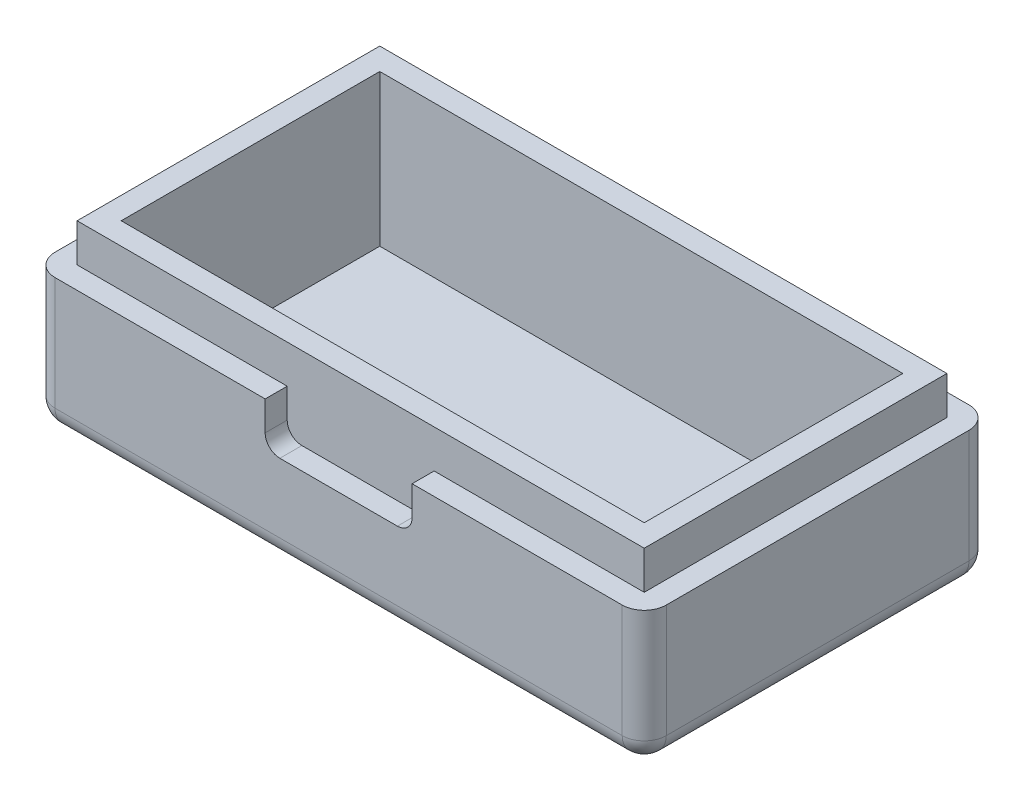
ISO-10303-21;
HEADER;
FILE_DESCRIPTION(('STEP AP214'),'2;1');
FILE_NAME('part.step','',(''),(''),'','','');
FILE_SCHEMA(('AUTOMOTIVE_DESIGN { 1 0 10303 214 1 1 1 1 }'));
ENDSEC;
DATA;
#1=APPLICATION_CONTEXT('core data for automotive mechanical design processes');
#2=APPLICATION_PROTOCOL_DEFINITION('international standard','automotive_design',2000,#1);
#3=PRODUCT_CONTEXT('',#1,'mechanical');
#4=PRODUCT('Part','Part','',(#3));
#5=PRODUCT_RELATED_PRODUCT_CATEGORY('part','',(#4));
#6=PRODUCT_DEFINITION_FORMATION('','',#4);
#7=PRODUCT_DEFINITION_CONTEXT('part definition',#1,'design');
#8=PRODUCT_DEFINITION('design','',#6,#7);
#9=PRODUCT_DEFINITION_SHAPE('','',#8);
#10=(LENGTH_UNIT() NAMED_UNIT(*) SI_UNIT(.MILLI.,.METRE.));
#11=(NAMED_UNIT(*) PLANE_ANGLE_UNIT() SI_UNIT($,.RADIAN.));
#12=(NAMED_UNIT(*) SI_UNIT($,.STERADIAN.) SOLID_ANGLE_UNIT());
#13=UNCERTAINTY_MEASURE_WITH_UNIT(LENGTH_MEASURE(1.E-05),#10,'distance_accuracy_value','');
#14=(GEOMETRIC_REPRESENTATION_CONTEXT(3) GLOBAL_UNCERTAINTY_ASSIGNED_CONTEXT((#13)) GLOBAL_UNIT_ASSIGNED_CONTEXT((#10,
#11,#12)) REPRESENTATION_CONTEXT('',''));
#15=CARTESIAN_POINT('',(0.,0.,0.));
#16=DIRECTION('',(0.,0.,1.));
#17=DIRECTION('',(1.,0.,0.));
#18=AXIS2_PLACEMENT_3D('',#15,#16,#17);
#19=CARTESIAN_POINT('',(0.,9.2,0.));
#20=DIRECTION('',(0.,1.,0.));
#21=DIRECTION('',(0.,0.,1.));
#22=AXIS2_PLACEMENT_3D('',#19,#20,#21);
#23=PLANE('',#22);
#24=DIRECTION('',(0.,0.,1.));
#25=VECTOR('',#24,1.);
#26=CARTESIAN_POINT('',(15.8,9.2,-11.9403065089106));
#27=LINE('',#26,#25);
#28=CARTESIAN_POINT('',(15.8,9.2,-1.5));
#29=VERTEX_POINT('',#28);
#30=CARTESIAN_POINT('',(15.8,9.2,0.));
#31=VERTEX_POINT('',#30);
#32=EDGE_CURVE('E263',#29,#31,#27,.T.);
#33=ORIENTED_EDGE('',*,*,#32,.F.);
#34=DIRECTION('',(1.,0.,0.));
#35=VECTOR('',#34,1.);
#36=CARTESIAN_POINT('',(1.5,9.2,-1.5));
#37=LINE('',#36,#35);
#38=CARTESIAN_POINT('',(1.5,9.2,-1.5));
#39=VERTEX_POINT('',#38);
#40=EDGE_CURVE('E316',#39,#29,#37,.T.);
#41=ORIENTED_EDGE('',*,*,#40,.F.);
#42=DIRECTION('',(0.,0.,1.));
#43=VECTOR('',#42,1.);
#44=CARTESIAN_POINT('',(1.5,9.2,-22.1));
#45=LINE('',#44,#43);
#46=CARTESIAN_POINT('',(1.5,9.2,-22.1));
#47=VERTEX_POINT('',#46);
#48=EDGE_CURVE('E311',#47,#39,#45,.T.);
#49=ORIENTED_EDGE('',*,*,#48,.F.);
#50=DIRECTION('',(-1.,0.,0.));
#51=VECTOR('',#50,1.);
#52=CARTESIAN_POINT('',(1.5,9.2,-22.1));
#53=LINE('',#52,#51);
#54=CARTESIAN_POINT('',(15.8,9.2,-22.1));
#55=VERTEX_POINT('',#54);
#56=EDGE_CURVE('E322',#55,#47,#53,.T.);
#57=ORIENTED_EDGE('',*,*,#56,.F.);
#58=DIRECTION('',(0.,0.,-1.));
#59=VECTOR('',#58,1.);
#60=CARTESIAN_POINT('',(15.8,9.2,-11.6596934910894));
#61=LINE('',#60,#59);
#62=CARTESIAN_POINT('',(15.8,9.2,-23.6));
#63=VERTEX_POINT('',#62);
#64=EDGE_CURVE('E299',#55,#63,#61,.T.);
#65=ORIENTED_EDGE('',*,*,#64,.T.);
#66=DIRECTION('',(-1.,0.,0.));
#67=VECTOR('',#66,1.);
#68=CARTESIAN_POINT('',(0.,9.2,-23.6));
#69=LINE('',#68,#67);
#70=CARTESIAN_POINT('',(1.49999999999999,9.2,-23.6));
#71=VERTEX_POINT('',#70);
#72=EDGE_CURVE('E356',#63,#71,#69,.T.);
#73=ORIENTED_EDGE('',*,*,#72,.T.);
#74=CARTESIAN_POINT('',(1.49999999999999,9.2,-22.1));
#75=DIRECTION('',(0.,1.,0.));
#76=DIRECTION('',(0.,0.,1.));
#77=AXIS2_PLACEMENT_3D('',#74,#75,#76);
#78=CIRCLE('',#77,1.5);
#79=CARTESIAN_POINT('',(0.,9.2,-22.1));
#80=VERTEX_POINT('',#79);
#81=EDGE_CURVE('E430',#71,#80,#78,.T.);
#82=ORIENTED_EDGE('',*,*,#81,.T.);
#83=DIRECTION('',(0.,0.,1.));
#84=VECTOR('',#83,1.);
#85=CARTESIAN_POINT('',(0.,9.2,-23.6));
#86=LINE('',#85,#84);
#87=CARTESIAN_POINT('',(0.,9.2,-1.5));
#88=VERTEX_POINT('',#87);
#89=EDGE_CURVE('E340',#80,#88,#86,.T.);
#90=ORIENTED_EDGE('',*,*,#89,.T.);
#91=CARTESIAN_POINT('',(1.5,9.2,-1.5));
#92=DIRECTION('',(0.,1.,0.));
#93=DIRECTION('',(0.,0.,1.));
#94=AXIS2_PLACEMENT_3D('',#91,#92,#93);
#95=CIRCLE('',#94,1.5);
#96=CARTESIAN_POINT('',(1.5,9.2,0.));
#97=VERTEX_POINT('',#96);
#98=EDGE_CURVE('E43',#88,#97,#95,.T.);
#99=ORIENTED_EDGE('',*,*,#98,.T.);
#100=DIRECTION('',(1.,0.,0.));
#101=VECTOR('',#100,1.);
#102=CARTESIAN_POINT('',(0.,9.2,0.));
#103=LINE('',#102,#101);
#104=EDGE_CURVE('E350',#97,#31,#103,.T.);
#105=ORIENTED_EDGE('',*,*,#104,.T.);
#106=EDGE_LOOP('',(#33,#41,#49,#57,#65,#73,#82,#90,#99,#105));
#107=FACE_BOUND('',#106,.T.);
#108=ADVANCED_FACE('F34',(#107),#23,.T.);
#109=CARTESIAN_POINT('',(0.,11.8,0.));
#110=DIRECTION('',(0.,-1.,0.));
#111=DIRECTION('',(0.,0.,-1.));
#112=AXIS2_PLACEMENT_3D('',#109,#110,#111);
#113=PLANE('',#112);
#114=DIRECTION('',(-1.,0.,0.));
#115=VECTOR('',#114,1.);
#116=CARTESIAN_POINT('',(2.99999999999999,11.8,-20.6));
#117=LINE('',#116,#115);
#118=CARTESIAN_POINT('',(38.6,11.8,-20.6));
#119=VERTEX_POINT('',#118);
#120=CARTESIAN_POINT('',(2.99999999999999,11.8,-20.6));
#121=VERTEX_POINT('',#120);
#122=EDGE_CURVE('E376',#119,#121,#117,.T.);
#123=ORIENTED_EDGE('',*,*,#122,.F.);
#124=DIRECTION('',(0.,0.,-1.));
#125=VECTOR('',#124,1.);
#126=CARTESIAN_POINT('',(38.6,11.8,-3.00000000000001));
#127=LINE('',#126,#125);
#128=CARTESIAN_POINT('',(38.6,11.8,-3.00000000000001));
#129=VERTEX_POINT('',#128);
#130=EDGE_CURVE('E360',#129,#119,#127,.T.);
#131=ORIENTED_EDGE('',*,*,#130,.F.);
#132=DIRECTION('',(1.,0.,0.));
#133=VECTOR('',#132,1.);
#134=CARTESIAN_POINT('',(2.99999999999999,11.8,-3.00000000000001));
#135=LINE('',#134,#133);
#136=CARTESIAN_POINT('',(2.99999999999999,11.8,-3.00000000000001));
#137=VERTEX_POINT('',#136);
#138=EDGE_CURVE('E365',#137,#129,#135,.T.);
#139=ORIENTED_EDGE('',*,*,#138,.F.);
#140=DIRECTION('',(0.,0.,1.));
#141=VECTOR('',#140,1.);
#142=CARTESIAN_POINT('',(2.99999999999999,11.8,-3.00000000000001));
#143=LINE('',#142,#141);
#144=EDGE_CURVE('E379',#121,#137,#143,.T.);
#145=ORIENTED_EDGE('',*,*,#144,.F.);
#146=EDGE_LOOP('',(#123,#131,#139,#145));
#147=FACE_BOUND('',#146,.T.);
#148=DIRECTION('',(0.,0.,1.));
#149=VECTOR('',#148,1.);
#150=CARTESIAN_POINT('',(1.5,11.8,-22.1));
#151=LINE('',#150,#149);
#152=CARTESIAN_POINT('',(1.5,11.8,-22.1));
#153=VERTEX_POINT('',#152);
#154=CARTESIAN_POINT('',(1.5,11.8,-1.5));
#155=VERTEX_POINT('',#154);
#156=EDGE_CURVE('E327',#153,#155,#151,.T.);
#157=ORIENTED_EDGE('',*,*,#156,.T.);
#158=DIRECTION('',(1.,0.,0.));
#159=VECTOR('',#158,1.);
#160=CARTESIAN_POINT('',(1.5,11.8,-1.5));
#161=LINE('',#160,#159);
#162=CARTESIAN_POINT('',(40.1,11.8,-1.5));
#163=VERTEX_POINT('',#162);
#164=EDGE_CURVE('E330',#155,#163,#161,.T.);
#165=ORIENTED_EDGE('',*,*,#164,.T.);
#166=DIRECTION('',(0.,0.,-1.));
#167=VECTOR('',#166,1.);
#168=CARTESIAN_POINT('',(40.1,11.8,-22.1));
#169=LINE('',#168,#167);
#170=CARTESIAN_POINT('',(40.1,11.8,-22.1));
#171=VERTEX_POINT('',#170);
#172=EDGE_CURVE('E333',#163,#171,#169,.T.);
#173=ORIENTED_EDGE('',*,*,#172,.T.);
#174=DIRECTION('',(-1.,0.,0.));
#175=VECTOR('',#174,1.);
#176=CARTESIAN_POINT('',(1.5,11.8,-22.1));
#177=LINE('',#176,#175);
#178=EDGE_CURVE('E315',#171,#153,#177,.T.);
#179=ORIENTED_EDGE('',*,*,#178,.T.);
#180=EDGE_LOOP('',(#157,#165,#173,#179));
#181=FACE_BOUND('',#180,.T.);
#182=ADVANCED_FACE('F521',(#147,#181),#113,.F.);
#183=CARTESIAN_POINT('',(38.6,1.5,-3.00000000000001));
#184=DIRECTION('',(1.,0.,0.));
#185=DIRECTION('',(0.,0.,-1.));
#186=AXIS2_PLACEMENT_3D('',#183,#184,#185);
#187=PLANE('',#186);
#188=ORIENTED_EDGE('',*,*,#130,.T.);
#189=DIRECTION('',(0.,1.,0.));
#190=VECTOR('',#189,1.);
#191=CARTESIAN_POINT('',(38.6,1.5,-20.6));
#192=LINE('',#191,#190);
#193=CARTESIAN_POINT('',(38.6,1.5,-20.6));
#194=VERTEX_POINT('',#193);
#195=EDGE_CURVE('E374',#194,#119,#192,.T.);
#196=ORIENTED_EDGE('',*,*,#195,.F.);
#197=DIRECTION('',(0.,0.,-1.));
#198=VECTOR('',#197,1.);
#199=CARTESIAN_POINT('',(38.6,1.5,-3.00000000000001));
#200=LINE('',#199,#198);
#201=CARTESIAN_POINT('',(38.6,1.5,-3.00000000000001));
#202=VERTEX_POINT('',#201);
#203=EDGE_CURVE('E361',#202,#194,#200,.T.);
#204=ORIENTED_EDGE('',*,*,#203,.F.);
#205=DIRECTION('',(0.,1.,0.));
#206=VECTOR('',#205,1.);
#207=CARTESIAN_POINT('',(38.6,1.5,-3.00000000000001));
#208=LINE('',#207,#206);
#209=EDGE_CURVE('E384',#202,#129,#208,.T.);
#210=ORIENTED_EDGE('',*,*,#209,.T.);
#211=EDGE_LOOP('',(#188,#196,#204,#210));
#212=FACE_BOUND('',#211,.T.);
#213=ADVANCED_FACE('F527',(#212),#187,.F.);
#214=CARTESIAN_POINT('',(2.99999999999999,1.5,-3.00000000000001));
#215=DIRECTION('',(0.,0.,1.));
#216=DIRECTION('',(1.,0.,0.));
#217=AXIS2_PLACEMENT_3D('',#214,#215,#216);
#218=PLANE('',#217);
#219=ORIENTED_EDGE('',*,*,#138,.T.);
#220=ORIENTED_EDGE('',*,*,#209,.F.);
#221=DIRECTION('',(1.,0.,0.));
#222=VECTOR('',#221,1.);
#223=CARTESIAN_POINT('',(2.99999999999999,1.5,-3.00000000000001));
#224=LINE('',#223,#222);
#225=CARTESIAN_POINT('',(2.99999999999999,1.5,-3.00000000000001));
#226=VERTEX_POINT('',#225);
#227=EDGE_CURVE('E371',#226,#202,#224,.T.);
#228=ORIENTED_EDGE('',*,*,#227,.F.);
#229=DIRECTION('',(0.,1.,0.));
#230=VECTOR('',#229,1.);
#231=CARTESIAN_POINT('',(2.99999999999999,1.5,-3.00000000000001));
#232=LINE('',#231,#230);
#233=EDGE_CURVE('E387',#226,#137,#232,.T.);
#234=ORIENTED_EDGE('',*,*,#233,.T.);
#235=EDGE_LOOP('',(#219,#220,#228,#234));
#236=FACE_BOUND('',#235,.T.);
#237=ADVANCED_FACE('F839',(#236),#218,.F.);
#238=CARTESIAN_POINT('',(2.99999999999999,1.5,-3.00000000000001));
#239=DIRECTION('',(-1.,0.,0.));
#240=DIRECTION('',(0.,0.,1.));
#241=AXIS2_PLACEMENT_3D('',#238,#239,#240);
#242=PLANE('',#241);
#243=ORIENTED_EDGE('',*,*,#144,.T.);
#244=ORIENTED_EDGE('',*,*,#233,.F.);
#245=DIRECTION('',(0.,0.,1.));
#246=VECTOR('',#245,1.);
#247=CARTESIAN_POINT('',(2.99999999999999,1.5,-3.00000000000001));
#248=LINE('',#247,#246);
#249=CARTESIAN_POINT('',(2.99999999999999,1.5,-20.6));
#250=VERTEX_POINT('',#249);
#251=EDGE_CURVE('E368',#250,#226,#248,.T.);
#252=ORIENTED_EDGE('',*,*,#251,.F.);
#253=DIRECTION('',(0.,1.,0.));
#254=VECTOR('',#253,1.);
#255=CARTESIAN_POINT('',(2.99999999999999,1.5,-20.6));
#256=LINE('',#255,#254);
#257=EDGE_CURVE('E389',#250,#121,#256,.T.);
#258=ORIENTED_EDGE('',*,*,#257,.T.);
#259=EDGE_LOOP('',(#243,#244,#252,#258));
#260=FACE_BOUND('',#259,.T.);
#261=ADVANCED_FACE('F843',(#260),#242,.F.);
#262=CARTESIAN_POINT('',(2.99999999999999,1.5,-20.6));
#263=DIRECTION('',(0.,0.,-1.));
#264=DIRECTION('',(-1.,0.,0.));
#265=AXIS2_PLACEMENT_3D('',#262,#263,#264);
#266=PLANE('',#265);
#267=ORIENTED_EDGE('',*,*,#122,.T.);
#268=ORIENTED_EDGE('',*,*,#257,.F.);
#269=DIRECTION('',(-1.,0.,0.));
#270=VECTOR('',#269,1.);
#271=CARTESIAN_POINT('',(2.99999999999999,1.5,-20.6));
#272=LINE('',#271,#270);
#273=EDGE_CURVE('E364',#194,#250,#272,.T.);
#274=ORIENTED_EDGE('',*,*,#273,.F.);
#275=ORIENTED_EDGE('',*,*,#195,.T.);
#276=EDGE_LOOP('',(#267,#268,#274,#275));
#277=FACE_BOUND('',#276,.T.);
#278=ADVANCED_FACE('F542',(#277),#266,.F.);
#279=CARTESIAN_POINT('',(0.,1.5,0.));
#280=DIRECTION('',(0.,-1.,0.));
#281=DIRECTION('',(0.,0.,-1.));
#282=AXIS2_PLACEMENT_3D('',#279,#280,#281);
#283=PLANE('',#282);
#284=ORIENTED_EDGE('',*,*,#203,.T.);
#285=ORIENTED_EDGE('',*,*,#273,.T.);
#286=ORIENTED_EDGE('',*,*,#251,.T.);
#287=ORIENTED_EDGE('',*,*,#227,.T.);
#288=EDGE_LOOP('',(#284,#285,#286,#287));
#289=FACE_BOUND('',#288,.T.);
#290=ADVANCED_FACE('F534',(#289),#283,.F.);
#291=DIRECTION('',(0.,0.,1.));
#292=VECTOR('',#291,1.);
#293=CARTESIAN_POINT('',(25.8,9.2,-11.9403065089106));
#294=LINE('',#293,#292);
#295=CARTESIAN_POINT('',(25.8,9.2,-1.5));
#296=VERTEX_POINT('',#295);
#297=CARTESIAN_POINT('',(25.8,9.2,0.));
#298=VERTEX_POINT('',#297);
#299=EDGE_CURVE('E265',#296,#298,#294,.T.);
#300=ORIENTED_EDGE('',*,*,#299,.T.);
#301=CARTESIAN_POINT('',(40.1,9.2,0.));
#302=VERTEX_POINT('',#301);
#303=EDGE_CURVE('E349',#298,#302,#103,.T.);
#304=ORIENTED_EDGE('',*,*,#303,.T.);
#305=CARTESIAN_POINT('',(40.1,9.2,-1.5));
#306=DIRECTION('',(0.,1.,0.));
#307=DIRECTION('',(0.,0.,1.));
#308=AXIS2_PLACEMENT_3D('',#305,#306,#307);
#309=CIRCLE('',#308,1.5);
#310=CARTESIAN_POINT('',(41.6,9.2,-1.5));
#311=VERTEX_POINT('',#310);
#312=EDGE_CURVE('E11',#302,#311,#309,.T.);
#313=ORIENTED_EDGE('',*,*,#312,.T.);
#314=DIRECTION('',(0.,0.,-1.));
#315=VECTOR('',#314,1.);
#316=CARTESIAN_POINT('',(41.6,9.2,-23.6));
#317=LINE('',#316,#315);
#318=CARTESIAN_POINT('',(41.6,9.2,-22.1));
#319=VERTEX_POINT('',#318);
#320=EDGE_CURVE('E353',#311,#319,#317,.T.);
#321=ORIENTED_EDGE('',*,*,#320,.T.);
#322=CARTESIAN_POINT('',(40.1,9.2,-22.1));
#323=DIRECTION('',(0.,1.,0.));
#324=DIRECTION('',(0.,0.,1.));
#325=AXIS2_PLACEMENT_3D('',#322,#323,#324);
#326=CIRCLE('',#325,1.5);
#327=CARTESIAN_POINT('',(40.1,9.2,-23.6));
#328=VERTEX_POINT('',#327);
#329=EDGE_CURVE('E428',#319,#328,#326,.T.);
#330=ORIENTED_EDGE('',*,*,#329,.T.);
#331=CARTESIAN_POINT('',(25.8,9.2,-23.6));
#332=VERTEX_POINT('',#331);
#333=EDGE_CURVE('E357',#328,#332,#69,.T.);
#334=ORIENTED_EDGE('',*,*,#333,.T.);
#335=DIRECTION('',(0.,0.,-1.));
#336=VECTOR('',#335,1.);
#337=CARTESIAN_POINT('',(25.8,9.2,-11.6596934910894));
#338=LINE('',#337,#336);
#339=CARTESIAN_POINT('',(25.8,9.2,-22.1));
#340=VERTEX_POINT('',#339);
#341=EDGE_CURVE('E278',#340,#332,#338,.T.);
#342=ORIENTED_EDGE('',*,*,#341,.F.);
#343=CARTESIAN_POINT('',(40.1,9.2,-22.1));
#344=VERTEX_POINT('',#343);
#345=EDGE_CURVE('E323',#344,#340,#53,.T.);
#346=ORIENTED_EDGE('',*,*,#345,.F.);
#347=DIRECTION('',(0.,0.,-1.));
#348=VECTOR('',#347,1.);
#349=CARTESIAN_POINT('',(40.1,9.2,-22.1));
#350=LINE('',#349,#348);
#351=CARTESIAN_POINT('',(40.1,9.2,-1.5));
#352=VERTEX_POINT('',#351);
#353=EDGE_CURVE('E319',#352,#344,#350,.T.);
#354=ORIENTED_EDGE('',*,*,#353,.F.);
#355=EDGE_CURVE('E314',#296,#352,#37,.T.);
#356=ORIENTED_EDGE('',*,*,#355,.F.);
#357=EDGE_LOOP('',(#300,#304,#313,#321,#330,#334,#342,#346,#354,#356));
#358=FACE_BOUND('',#357,.T.);
#359=ADVANCED_FACE('F523',(#358),#23,.T.);
#360=CARTESIAN_POINT('',(1.5,9.2,-22.1));
#361=DIRECTION('',(-1.,0.,0.));
#362=DIRECTION('',(0.,0.,1.));
#363=AXIS2_PLACEMENT_3D('',#360,#361,#362);
#364=PLANE('',#363);
#365=ORIENTED_EDGE('',*,*,#156,.F.);
#366=DIRECTION('',(0.,1.,0.));
#367=VECTOR('',#366,1.);
#368=CARTESIAN_POINT('',(1.5,9.2,-22.1));
#369=LINE('',#368,#367);
#370=EDGE_CURVE('E338',#47,#153,#369,.T.);
#371=ORIENTED_EDGE('',*,*,#370,.F.);
#372=ORIENTED_EDGE('',*,*,#48,.T.);
#373=DIRECTION('',(0.,1.,0.));
#374=VECTOR('',#373,1.);
#375=CARTESIAN_POINT('',(1.5,9.2,-1.5));
#376=LINE('',#375,#374);
#377=EDGE_CURVE('E326',#39,#155,#376,.T.);
#378=ORIENTED_EDGE('',*,*,#377,.T.);
#379=EDGE_LOOP('',(#365,#371,#372,#378));
#380=FACE_BOUND('',#379,.T.);
#381=ADVANCED_FACE('F533',(#380),#364,.T.);
#382=CARTESIAN_POINT('',(1.5,9.2,-22.1));
#383=DIRECTION('',(0.,0.,-1.));
#384=DIRECTION('',(-1.,0.,0.));
#385=AXIS2_PLACEMENT_3D('',#382,#383,#384);
#386=PLANE('',#385);
#387=ORIENTED_EDGE('',*,*,#178,.F.);
#388=DIRECTION('',(0.,1.,0.));
#389=VECTOR('',#388,1.);
#390=CARTESIAN_POINT('',(40.1,9.2,-22.1));
#391=LINE('',#390,#389);
#392=EDGE_CURVE('E341',#344,#171,#391,.T.);
#393=ORIENTED_EDGE('',*,*,#392,.F.);
#394=ORIENTED_EDGE('',*,*,#345,.T.);
#395=DIRECTION('',(0.,1.,0.));
#396=VECTOR('',#395,1.);
#397=CARTESIAN_POINT('',(25.8,9.2,-22.1));
#398=LINE('',#397,#396);
#399=CARTESIAN_POINT('',(25.8,7.20000000000001,-22.1));
#400=VERTEX_POINT('',#399);
#401=EDGE_CURVE('E282',#400,#340,#398,.T.);
#402=ORIENTED_EDGE('',*,*,#401,.F.);
#403=CARTESIAN_POINT('',(24.8,7.2,-22.1));
#404=DIRECTION('',(0.,0.,-1.));
#405=DIRECTION('',(-1.,0.,0.));
#406=AXIS2_PLACEMENT_3D('',#403,#404,#405);
#407=CIRCLE('',#406,1.);
#408=CARTESIAN_POINT('',(24.8,6.2,-22.1));
#409=VERTEX_POINT('',#408);
#410=EDGE_CURVE('E284',#409,#400,#407,.F.);
#411=ORIENTED_EDGE('',*,*,#410,.F.);
#412=DIRECTION('',(1.,0.,0.));
#413=VECTOR('',#412,1.);
#414=CARTESIAN_POINT('',(24.8,6.2,-22.1));
#415=LINE('',#414,#413);
#416=CARTESIAN_POINT('',(16.8,6.2,-22.1));
#417=VERTEX_POINT('',#416);
#418=EDGE_CURVE('E275',#417,#409,#415,.T.);
#419=ORIENTED_EDGE('',*,*,#418,.F.);
#420=CARTESIAN_POINT('',(16.8,7.2,-22.1));
#421=DIRECTION('',(0.,0.,-1.));
#422=DIRECTION('',(-1.,0.,0.));
#423=AXIS2_PLACEMENT_3D('',#420,#421,#422);
#424=CIRCLE('',#423,1.);
#425=CARTESIAN_POINT('',(15.8,7.2,-22.1));
#426=VERTEX_POINT('',#425);
#427=EDGE_CURVE('E277',#426,#417,#424,.F.);
#428=ORIENTED_EDGE('',*,*,#427,.F.);
#429=DIRECTION('',(0.,-1.,0.));
#430=VECTOR('',#429,1.);
#431=CARTESIAN_POINT('',(15.8,9.2,-22.1));
#432=LINE('',#431,#430);
#433=EDGE_CURVE('E280',#55,#426,#432,.T.);
#434=ORIENTED_EDGE('',*,*,#433,.F.);
#435=ORIENTED_EDGE('',*,*,#56,.T.);
#436=ORIENTED_EDGE('',*,*,#370,.T.);
#437=EDGE_LOOP('',(#387,#393,#394,#402,#411,#419,#428,#434,#435,#436));
#438=FACE_BOUND('',#437,.T.);
#439=ADVANCED_FACE('F540',(#438),#386,.T.);
#440=CARTESIAN_POINT('',(40.1,9.2,-22.1));
#441=DIRECTION('',(1.,0.,0.));
#442=DIRECTION('',(0.,0.,-1.));
#443=AXIS2_PLACEMENT_3D('',#440,#441,#442);
#444=PLANE('',#443);
#445=ORIENTED_EDGE('',*,*,#172,.F.);
#446=DIRECTION('',(0.,1.,0.));
#447=VECTOR('',#446,1.);
#448=CARTESIAN_POINT('',(40.1,9.2,-1.5));
#449=LINE('',#448,#447);
#450=EDGE_CURVE('E343',#352,#163,#449,.T.);
#451=ORIENTED_EDGE('',*,*,#450,.F.);
#452=ORIENTED_EDGE('',*,*,#353,.T.);
#453=ORIENTED_EDGE('',*,*,#392,.T.);
#454=EDGE_LOOP('',(#445,#451,#452,#453));
#455=FACE_BOUND('',#454,.T.);
#456=ADVANCED_FACE('F608',(#455),#444,.T.);
#457=CARTESIAN_POINT('',(1.5,9.2,-1.5));
#458=DIRECTION('',(0.,0.,1.));
#459=DIRECTION('',(1.,0.,0.));
#460=AXIS2_PLACEMENT_3D('',#457,#458,#459);
#461=PLANE('',#460);
#462=ORIENTED_EDGE('',*,*,#164,.F.);
#463=ORIENTED_EDGE('',*,*,#377,.F.);
#464=ORIENTED_EDGE('',*,*,#40,.T.);
#465=DIRECTION('',(0.,1.,0.));
#466=VECTOR('',#465,1.);
#467=CARTESIAN_POINT('',(15.8,9.2,-1.5));
#468=LINE('',#467,#466);
#469=CARTESIAN_POINT('',(15.8,7.20000000000001,-1.5));
#470=VERTEX_POINT('',#469);
#471=EDGE_CURVE('E274',#470,#29,#468,.T.);
#472=ORIENTED_EDGE('',*,*,#471,.F.);
#473=CARTESIAN_POINT('',(16.8,7.2,-1.5));
#474=DIRECTION('',(0.,0.,1.));
#475=DIRECTION('',(1.,0.,0.));
#476=AXIS2_PLACEMENT_3D('',#473,#474,#475);
#477=CIRCLE('',#476,1.);
#478=CARTESIAN_POINT('',(16.8,6.2,-1.5));
#479=VERTEX_POINT('',#478);
#480=EDGE_CURVE('E272',#479,#470,#477,.F.);
#481=ORIENTED_EDGE('',*,*,#480,.F.);
#482=DIRECTION('',(-1.,0.,0.));
#483=VECTOR('',#482,1.);
#484=CARTESIAN_POINT('',(16.8,6.2,-1.5));
#485=LINE('',#484,#483);
#486=CARTESIAN_POINT('',(24.8,6.2,-1.5));
#487=VERTEX_POINT('',#486);
#488=EDGE_CURVE('E242',#487,#479,#485,.T.);
#489=ORIENTED_EDGE('',*,*,#488,.F.);
#490=CARTESIAN_POINT('',(24.8,7.2,-1.5));
#491=DIRECTION('',(0.,0.,1.));
#492=DIRECTION('',(1.,0.,0.));
#493=AXIS2_PLACEMENT_3D('',#490,#491,#492);
#494=CIRCLE('',#493,1.);
#495=CARTESIAN_POINT('',(25.8,7.2,-1.5));
#496=VERTEX_POINT('',#495);
#497=EDGE_CURVE('E493',#496,#487,#494,.F.);
#498=ORIENTED_EDGE('',*,*,#497,.F.);
#499=DIRECTION('',(0.,-1.,0.));
#500=VECTOR('',#499,1.);
#501=CARTESIAN_POINT('',(25.8,9.2,-1.5));
#502=LINE('',#501,#500);
#503=EDGE_CURVE('E491',#296,#496,#502,.T.);
#504=ORIENTED_EDGE('',*,*,#503,.F.);
#505=ORIENTED_EDGE('',*,*,#355,.T.);
#506=ORIENTED_EDGE('',*,*,#450,.T.);
#507=EDGE_LOOP('',(#462,#463,#464,#472,#481,#489,#498,#504,#505,#506));
#508=FACE_BOUND('',#507,.T.);
#509=ADVANCED_FACE('F501',(#508),#461,.T.);
#510=CARTESIAN_POINT('',(0.,0.,0.));
#511=DIRECTION('',(0.,-1.,0.));
#512=DIRECTION('',(0.,0.,-1.));
#513=AXIS2_PLACEMENT_3D('',#510,#511,#512);
#514=PLANE('',#513);
#515=DIRECTION('',(0.,0.,-1.));
#516=VECTOR('',#515,1.);
#517=CARTESIAN_POINT('',(40.1,0.,0.));
#518=LINE('',#517,#516);
#519=CARTESIAN_POINT('',(40.1,0.,-22.1));
#520=VERTEX_POINT('',#519);
#521=CARTESIAN_POINT('',(40.1,0.,-1.5));
#522=VERTEX_POINT('',#521);
#523=EDGE_CURVE('E404',#520,#522,#518,.F.);
#524=ORIENTED_EDGE('',*,*,#523,.T.);
#525=DIRECTION('',(1.,0.,0.));
#526=VECTOR('',#525,1.);
#527=CARTESIAN_POINT('',(0.,0.,-1.5));
#528=LINE('',#527,#526);
#529=CARTESIAN_POINT('',(1.5,0.,-1.5));
#530=VERTEX_POINT('',#529);
#531=EDGE_CURVE('E406',#522,#530,#528,.F.);
#532=ORIENTED_EDGE('',*,*,#531,.T.);
#533=DIRECTION('',(0.,0.,1.));
#534=VECTOR('',#533,1.);
#535=CARTESIAN_POINT('',(1.49999999999999,0.,-23.6));
#536=LINE('',#535,#534);
#537=CARTESIAN_POINT('',(1.49999999999999,0.,-22.1));
#538=VERTEX_POINT('',#537);
#539=EDGE_CURVE('E400',#530,#538,#536,.F.);
#540=ORIENTED_EDGE('',*,*,#539,.T.);
#541=DIRECTION('',(-1.,0.,0.));
#542=VECTOR('',#541,1.);
#543=CARTESIAN_POINT('',(41.6,0.,-22.1));
#544=LINE('',#543,#542);
#545=EDGE_CURVE('E402',#538,#520,#544,.F.);
#546=ORIENTED_EDGE('',*,*,#545,.T.);
#547=EDGE_LOOP('',(#524,#532,#540,#546));
#548=FACE_BOUND('',#547,.T.);
#549=ADVANCED_FACE('F575',(#548),#514,.T.);
#550=CARTESIAN_POINT('',(0.,11.8,-23.6));
#551=DIRECTION('',(0.,0.,1.));
#552=DIRECTION('',(1.,0.,0.));
#553=AXIS2_PLACEMENT_3D('',#550,#551,#552);
#554=PLANE('',#553);
#555=CARTESIAN_POINT('',(24.8,7.2,-23.6));
#556=DIRECTION('',(0.,0.,-1.));
#557=DIRECTION('',(-1.,0.,0.));
#558=AXIS2_PLACEMENT_3D('',#555,#556,#557);
#559=CIRCLE('',#558,1.);
#560=CARTESIAN_POINT('',(25.8,7.2,-23.6));
#561=VERTEX_POINT('',#560);
#562=CARTESIAN_POINT('',(24.8,6.2,-23.6));
#563=VERTEX_POINT('',#562);
#564=EDGE_CURVE('E286',#561,#563,#559,.T.);
#565=ORIENTED_EDGE('',*,*,#564,.F.);
#566=DIRECTION('',(0.,-1.,0.));
#567=VECTOR('',#566,1.);
#568=CARTESIAN_POINT('',(25.8,9.2,-23.6));
#569=LINE('',#568,#567);
#570=EDGE_CURVE('E59',#332,#561,#569,.T.);
#571=ORIENTED_EDGE('',*,*,#570,.F.);
#572=ORIENTED_EDGE('',*,*,#333,.F.);
#573=DIRECTION('',(0.,-1.,0.));
#574=VECTOR('',#573,1.);
#575=CARTESIAN_POINT('',(40.1,11.8,-23.6));
#576=LINE('',#575,#574);
#577=CARTESIAN_POINT('',(40.1,1.5,-23.6));
#578=VERTEX_POINT('',#577);
#579=EDGE_CURVE('E415',#328,#578,#576,.T.);
#580=ORIENTED_EDGE('',*,*,#579,.T.);
#581=DIRECTION('',(-1.,0.,0.));
#582=VECTOR('',#581,1.);
#583=CARTESIAN_POINT('',(0.,1.5,-23.6));
#584=LINE('',#583,#582);
#585=CARTESIAN_POINT('',(1.49999999999999,1.5,-23.6));
#586=VERTEX_POINT('',#585);
#587=EDGE_CURVE('E417',#578,#586,#584,.T.);
#588=ORIENTED_EDGE('',*,*,#587,.T.);
#589=DIRECTION('',(0.,-1.,0.));
#590=VECTOR('',#589,1.);
#591=CARTESIAN_POINT('',(1.49999999999999,11.8,-23.6));
#592=LINE('',#591,#590);
#593=EDGE_CURVE('E419',#586,#71,#592,.F.);
#594=ORIENTED_EDGE('',*,*,#593,.T.);
#595=ORIENTED_EDGE('',*,*,#72,.F.);
#596=DIRECTION('',(0.,1.,0.));
#597=VECTOR('',#596,1.);
#598=CARTESIAN_POINT('',(15.8,9.2,-23.6));
#599=LINE('',#598,#597);
#600=CARTESIAN_POINT('',(15.8,7.20000000000001,-23.6));
#601=VERTEX_POINT('',#600);
#602=EDGE_CURVE('E295',#601,#63,#599,.T.);
#603=ORIENTED_EDGE('',*,*,#602,.F.);
#604=CARTESIAN_POINT('',(16.8,7.2,-23.6));
#605=DIRECTION('',(0.,0.,-1.));
#606=DIRECTION('',(-1.,0.,0.));
#607=AXIS2_PLACEMENT_3D('',#604,#605,#606);
#608=CIRCLE('',#607,1.);
#609=CARTESIAN_POINT('',(16.8,6.2,-23.6));
#610=VERTEX_POINT('',#609);
#611=EDGE_CURVE('E292',#610,#601,#608,.T.);
#612=ORIENTED_EDGE('',*,*,#611,.F.);
#613=DIRECTION('',(-1.,0.,0.));
#614=VECTOR('',#613,1.);
#615=CARTESIAN_POINT('',(24.8,6.2,-23.6));
#616=LINE('',#615,#614);
#617=EDGE_CURVE('E289',#563,#610,#616,.T.);
#618=ORIENTED_EDGE('',*,*,#617,.F.);
#619=EDGE_LOOP('',(#565,#571,#572,#580,#588,#594,#595,#603,#612,#618));
#620=FACE_BOUND('',#619,.T.);
#621=ADVANCED_FACE('F580',(#620),#554,.F.);
#622=CARTESIAN_POINT('',(41.6,11.8,0.));
#623=DIRECTION('',(-1.,0.,0.));
#624=DIRECTION('',(0.,0.,1.));
#625=AXIS2_PLACEMENT_3D('',#622,#623,#624);
#626=PLANE('',#625);
#627=ORIENTED_EDGE('',*,*,#320,.F.);
#628=DIRECTION('',(0.,-1.,0.));
#629=VECTOR('',#628,1.);
#630=CARTESIAN_POINT('',(41.6,11.8,-1.5));
#631=LINE('',#630,#629);
#632=CARTESIAN_POINT('',(41.6,1.5,-1.5));
#633=VERTEX_POINT('',#632);
#634=EDGE_CURVE('E413',#311,#633,#631,.T.);
#635=ORIENTED_EDGE('',*,*,#634,.T.);
#636=DIRECTION('',(0.,0.,-1.));
#637=VECTOR('',#636,1.);
#638=CARTESIAN_POINT('',(41.6,1.5,-23.6));
#639=LINE('',#638,#637);
#640=CARTESIAN_POINT('',(41.6,1.5,-22.1));
#641=VERTEX_POINT('',#640);
#642=EDGE_CURVE('E411',#633,#641,#639,.T.);
#643=ORIENTED_EDGE('',*,*,#642,.T.);
#644=DIRECTION('',(0.,-1.,0.));
#645=VECTOR('',#644,1.);
#646=CARTESIAN_POINT('',(41.6,11.8,-22.1));
#647=LINE('',#646,#645);
#648=EDGE_CURVE('E409',#641,#319,#647,.F.);
#649=ORIENTED_EDGE('',*,*,#648,.T.);
#650=EDGE_LOOP('',(#627,#635,#643,#649));
#651=FACE_BOUND('',#650,.T.);
#652=ADVANCED_FACE('F558',(#651),#626,.F.);
#653=CARTESIAN_POINT('',(0.,11.8,0.));
#654=DIRECTION('',(0.,0.,-1.));
#655=DIRECTION('',(-1.,0.,0.));
#656=AXIS2_PLACEMENT_3D('',#653,#654,#655);
#657=PLANE('',#656);
#658=CARTESIAN_POINT('',(16.8,7.2,0.));
#659=DIRECTION('',(0.,0.,1.));
#660=DIRECTION('',(1.,0.,0.));
#661=AXIS2_PLACEMENT_3D('',#658,#659,#660);
#662=CIRCLE('',#661,1.);
#663=CARTESIAN_POINT('',(15.8,7.2,0.));
#664=VERTEX_POINT('',#663);
#665=CARTESIAN_POINT('',(16.8,6.2,0.));
#666=VERTEX_POINT('',#665);
#667=EDGE_CURVE('E249',#664,#666,#662,.T.);
#668=ORIENTED_EDGE('',*,*,#667,.F.);
#669=DIRECTION('',(0.,-1.,0.));
#670=VECTOR('',#669,1.);
#671=CARTESIAN_POINT('',(15.8,9.2,0.));
#672=LINE('',#671,#670);
#673=EDGE_CURVE('E51',#31,#664,#672,.T.);
#674=ORIENTED_EDGE('',*,*,#673,.F.);
#675=ORIENTED_EDGE('',*,*,#104,.F.);
#676=DIRECTION('',(0.,-1.,0.));
#677=VECTOR('',#676,1.);
#678=CARTESIAN_POINT('',(1.5,11.8,0.));
#679=LINE('',#678,#677);
#680=CARTESIAN_POINT('',(1.5,1.5,0.));
#681=VERTEX_POINT('',#680);
#682=EDGE_CURVE('E386',#97,#681,#679,.T.);
#683=ORIENTED_EDGE('',*,*,#682,.T.);
#684=DIRECTION('',(1.,0.,0.));
#685=VECTOR('',#684,1.);
#686=CARTESIAN_POINT('',(41.6,1.5,0.));
#687=LINE('',#686,#685);
#688=CARTESIAN_POINT('',(40.1,1.5,0.));
#689=VERTEX_POINT('',#688);
#690=EDGE_CURVE('E394',#681,#689,#687,.T.);
#691=ORIENTED_EDGE('',*,*,#690,.T.);
#692=DIRECTION('',(0.,-1.,0.));
#693=VECTOR('',#692,1.);
#694=CARTESIAN_POINT('',(40.1,11.8,0.));
#695=LINE('',#694,#693);
#696=EDGE_CURVE('E397',#689,#302,#695,.F.);
#697=ORIENTED_EDGE('',*,*,#696,.T.);
#698=ORIENTED_EDGE('',*,*,#303,.F.);
#699=DIRECTION('',(0.,1.,0.));
#700=VECTOR('',#699,1.);
#701=CARTESIAN_POINT('',(25.8,9.2,0.));
#702=LINE('',#701,#700);
#703=CARTESIAN_POINT('',(25.8,7.20000000000001,0.));
#704=VERTEX_POINT('',#703);
#705=EDGE_CURVE('E258',#704,#298,#702,.T.);
#706=ORIENTED_EDGE('',*,*,#705,.F.);
#707=CARTESIAN_POINT('',(24.8,7.2,0.));
#708=DIRECTION('',(0.,0.,1.));
#709=DIRECTION('',(1.,0.,0.));
#710=AXIS2_PLACEMENT_3D('',#707,#708,#709);
#711=CIRCLE('',#710,1.);
#712=CARTESIAN_POINT('',(24.8,6.2,0.));
#713=VERTEX_POINT('',#712);
#714=EDGE_CURVE('E256',#713,#704,#711,.T.);
#715=ORIENTED_EDGE('',*,*,#714,.F.);
#716=DIRECTION('',(1.,0.,0.));
#717=VECTOR('',#716,1.);
#718=CARTESIAN_POINT('',(16.8,6.2,0.));
#719=LINE('',#718,#717);
#720=EDGE_CURVE('E239',#666,#713,#719,.T.);
#721=ORIENTED_EDGE('',*,*,#720,.F.);
#722=EDGE_LOOP('',(#668,#674,#675,#683,#691,#697,#698,#706,#715,#721));
#723=FACE_BOUND('',#722,.T.);
#724=ADVANCED_FACE('F253',(#723),#657,.F.);
#725=CARTESIAN_POINT('',(0.,11.8,0.));
#726=DIRECTION('',(1.,0.,0.));
#727=DIRECTION('',(0.,0.,-1.));
#728=AXIS2_PLACEMENT_3D('',#725,#726,#727);
#729=PLANE('',#728);
#730=DIRECTION('',(0.,0.,1.));
#731=VECTOR('',#730,1.);
#732=CARTESIAN_POINT('',(0.,1.5,0.));
#733=LINE('',#732,#731);
#734=CARTESIAN_POINT('',(0.,1.5,-22.1));
#735=VERTEX_POINT('',#734);
#736=CARTESIAN_POINT('',(0.,1.5,-1.5));
#737=VERTEX_POINT('',#736);
#738=EDGE_CURVE('E424',#735,#737,#733,.T.);
#739=ORIENTED_EDGE('',*,*,#738,.T.);
#740=DIRECTION('',(0.,-1.,0.));
#741=VECTOR('',#740,1.);
#742=CARTESIAN_POINT('',(0.,11.8,-1.5));
#743=LINE('',#742,#741);
#744=EDGE_CURVE('E426',#737,#88,#743,.F.);
#745=ORIENTED_EDGE('',*,*,#744,.T.);
#746=ORIENTED_EDGE('',*,*,#89,.F.);
#747=DIRECTION('',(0.,-1.,0.));
#748=VECTOR('',#747,1.);
#749=CARTESIAN_POINT('',(0.,11.8,-22.1));
#750=LINE('',#749,#748);
#751=EDGE_CURVE('E422',#80,#735,#750,.T.);
#752=ORIENTED_EDGE('',*,*,#751,.T.);
#753=EDGE_LOOP('',(#739,#745,#746,#752));
#754=FACE_BOUND('',#753,.T.);
#755=ADVANCED_FACE('F477',(#754),#729,.F.);
#756=CARTESIAN_POINT('',(1.49999999999999,11.8,-22.1));
#757=DIRECTION('',(0.,-1.,0.));
#758=DIRECTION('',(0.,0.,-1.));
#759=AXIS2_PLACEMENT_3D('',#756,#757,#758);
#760=CYLINDRICAL_SURFACE('',#759,1.5);
#761=ORIENTED_EDGE('',*,*,#81,.F.);
#762=ORIENTED_EDGE('',*,*,#593,.F.);
#763=CARTESIAN_POINT('',(1.49999999999999,1.5,-22.1));
#764=DIRECTION('',(0.,-1.,0.));
#765=DIRECTION('',(0.,0.,-1.));
#766=AXIS2_PLACEMENT_3D('',#763,#764,#765);
#767=CIRCLE('',#766,1.5);
#768=EDGE_CURVE('E459',#735,#586,#767,.T.);
#769=ORIENTED_EDGE('',*,*,#768,.F.);
#770=ORIENTED_EDGE('',*,*,#751,.F.);
#771=EDGE_LOOP('',(#761,#762,#769,#770));
#772=FACE_BOUND('',#771,.T.);
#773=ADVANCED_FACE('F36',(#772),#760,.T.);
#774=CARTESIAN_POINT('',(40.1,11.8,-22.1));
#775=DIRECTION('',(0.,-1.,0.));
#776=DIRECTION('',(0.,0.,-1.));
#777=AXIS2_PLACEMENT_3D('',#774,#775,#776);
#778=CYLINDRICAL_SURFACE('',#777,1.5);
#779=ORIENTED_EDGE('',*,*,#329,.F.);
#780=ORIENTED_EDGE('',*,*,#648,.F.);
#781=CARTESIAN_POINT('',(40.1,1.5,-22.1));
#782=DIRECTION('',(0.,-1.,0.));
#783=DIRECTION('',(0.,0.,-1.));
#784=AXIS2_PLACEMENT_3D('',#781,#782,#783);
#785=CIRCLE('',#784,1.5);
#786=EDGE_CURVE('E457',#578,#641,#785,.T.);
#787=ORIENTED_EDGE('',*,*,#786,.F.);
#788=ORIENTED_EDGE('',*,*,#579,.F.);
#789=EDGE_LOOP('',(#779,#780,#787,#788));
#790=FACE_BOUND('',#789,.T.);
#791=ADVANCED_FACE('F563',(#790),#778,.T.);
#792=CARTESIAN_POINT('',(0.,1.5,-22.1));
#793=DIRECTION('',(1.,0.,0.));
#794=DIRECTION('',(0.,0.,-1.));
#795=AXIS2_PLACEMENT_3D('',#792,#793,#794);
#796=CYLINDRICAL_SURFACE('',#795,1.5);
#797=CARTESIAN_POINT('',(1.49999999999999,1.5,-22.1));
#798=DIRECTION('',(-1.,0.,0.));
#799=DIRECTION('',(0.,0.,1.));
#800=AXIS2_PLACEMENT_3D('',#797,#798,#799);
#801=CIRCLE('',#800,1.5);
#802=EDGE_CURVE('E38',#586,#538,#801,.T.);
#803=ORIENTED_EDGE('',*,*,#802,.F.);
#804=ORIENTED_EDGE('',*,*,#587,.F.);
#805=CARTESIAN_POINT('',(40.1,1.5,-22.1));
#806=DIRECTION('',(1.,0.,0.));
#807=DIRECTION('',(0.,0.,-1.));
#808=AXIS2_PLACEMENT_3D('',#805,#806,#807);
#809=CIRCLE('',#808,1.5);
#810=EDGE_CURVE('E454',#520,#578,#809,.T.);
#811=ORIENTED_EDGE('',*,*,#810,.F.);
#812=ORIENTED_EDGE('',*,*,#545,.F.);
#813=EDGE_LOOP('',(#803,#804,#811,#812));
#814=FACE_BOUND('',#813,.T.);
#815=ADVANCED_FACE('F576',(#814),#796,.T.);
#816=CARTESIAN_POINT('',(1.49999999999999,1.5,-22.1));
#817=DIRECTION('',(0.,0.,1.));
#818=DIRECTION('',(1.,0.,0.));
#819=AXIS2_PLACEMENT_3D('',#816,#817,#818);
#820=SPHERICAL_SURFACE('',#819,1.5);
#821=ORIENTED_EDGE('',*,*,#768,.T.);
#822=ORIENTED_EDGE('',*,*,#802,.T.);
#823=CARTESIAN_POINT('',(1.49999999999999,1.5,-22.1));
#824=DIRECTION('',(0.,0.,-1.));
#825=DIRECTION('',(-1.,0.,0.));
#826=AXIS2_PLACEMENT_3D('',#823,#824,#825);
#827=CIRCLE('',#826,1.5);
#828=EDGE_CURVE('E451',#735,#538,#827,.F.);
#829=ORIENTED_EDGE('',*,*,#828,.F.);
#830=EDGE_LOOP('',(#821,#822,#829));
#831=FACE_BOUND('',#830,.T.);
#832=ADVANCED_FACE('F466',(#831),#820,.T.);
#833=CARTESIAN_POINT('',(40.1,1.5,-22.1));
#834=DIRECTION('',(0.,0.,1.));
#835=DIRECTION('',(1.,0.,0.));
#836=AXIS2_PLACEMENT_3D('',#833,#834,#835);
#837=SPHERICAL_SURFACE('',#836,1.5);
#838=ORIENTED_EDGE('',*,*,#810,.T.);
#839=ORIENTED_EDGE('',*,*,#786,.T.);
#840=CARTESIAN_POINT('',(40.1,1.5,-22.1));
#841=DIRECTION('',(0.,0.,-1.));
#842=DIRECTION('',(-1.,0.,0.));
#843=AXIS2_PLACEMENT_3D('',#840,#841,#842);
#844=CIRCLE('',#843,1.5);
#845=EDGE_CURVE('E448',#520,#641,#844,.F.);
#846=ORIENTED_EDGE('',*,*,#845,.F.);
#847=EDGE_LOOP('',(#838,#839,#846));
#848=FACE_BOUND('',#847,.T.);
#849=ADVANCED_FACE('F567',(#848),#837,.T.);
#850=CARTESIAN_POINT('',(1.5,1.5,0.));
#851=DIRECTION('',(0.,0.,-1.));
#852=DIRECTION('',(-1.,0.,0.));
#853=AXIS2_PLACEMENT_3D('',#850,#851,#852);
#854=CYLINDRICAL_SURFACE('',#853,1.5);
#855=ORIENTED_EDGE('',*,*,#828,.T.);
#856=ORIENTED_EDGE('',*,*,#539,.F.);
#857=CARTESIAN_POINT('',(1.5,1.5,-1.5));
#858=DIRECTION('',(0.,0.,1.));
#859=DIRECTION('',(1.,0.,0.));
#860=AXIS2_PLACEMENT_3D('',#857,#858,#859);
#861=CIRCLE('',#860,1.5);
#862=EDGE_CURVE('E445',#737,#530,#861,.T.);
#863=ORIENTED_EDGE('',*,*,#862,.F.);
#864=ORIENTED_EDGE('',*,*,#738,.F.);
#865=EDGE_LOOP('',(#855,#856,#863,#864));
#866=FACE_BOUND('',#865,.T.);
#867=ADVANCED_FACE('F473',(#866),#854,.T.);
#868=CARTESIAN_POINT('',(1.5,11.8,-1.5));
#869=DIRECTION('',(0.,-1.,0.));
#870=DIRECTION('',(0.,0.,-1.));
#871=AXIS2_PLACEMENT_3D('',#868,#869,#870);
#872=CYLINDRICAL_SURFACE('',#871,1.5);
#873=ORIENTED_EDGE('',*,*,#98,.F.);
#874=ORIENTED_EDGE('',*,*,#744,.F.);
#875=CARTESIAN_POINT('',(1.5,1.5,-1.5));
#876=DIRECTION('',(0.,-1.,0.));
#877=DIRECTION('',(0.,0.,-1.));
#878=AXIS2_PLACEMENT_3D('',#875,#876,#877);
#879=CIRCLE('',#878,1.5);
#880=EDGE_CURVE('E442',#681,#737,#879,.T.);
#881=ORIENTED_EDGE('',*,*,#880,.F.);
#882=ORIENTED_EDGE('',*,*,#682,.F.);
#883=EDGE_LOOP('',(#873,#874,#881,#882));
#884=FACE_BOUND('',#883,.T.);
#885=ADVANCED_FACE('F483',(#884),#872,.T.);
#886=CARTESIAN_POINT('',(40.1,11.8,-1.5));
#887=DIRECTION('',(0.,-1.,0.));
#888=DIRECTION('',(0.,0.,-1.));
#889=AXIS2_PLACEMENT_3D('',#886,#887,#888);
#890=CYLINDRICAL_SURFACE('',#889,1.5);
#891=ORIENTED_EDGE('',*,*,#312,.F.);
#892=ORIENTED_EDGE('',*,*,#696,.F.);
#893=CARTESIAN_POINT('',(40.1,1.5,-1.5));
#894=DIRECTION('',(0.,-1.,0.));
#895=DIRECTION('',(0.,0.,-1.));
#896=AXIS2_PLACEMENT_3D('',#893,#894,#895);
#897=CIRCLE('',#896,1.5);
#898=EDGE_CURVE('E439',#633,#689,#897,.T.);
#899=ORIENTED_EDGE('',*,*,#898,.F.);
#900=ORIENTED_EDGE('',*,*,#634,.F.);
#901=EDGE_LOOP('',(#891,#892,#899,#900));
#902=FACE_BOUND('',#901,.T.);
#903=ADVANCED_FACE('F554',(#902),#890,.T.);
#904=CARTESIAN_POINT('',(40.1,1.5,0.));
#905=DIRECTION('',(0.,0.,1.));
#906=DIRECTION('',(1.,0.,0.));
#907=AXIS2_PLACEMENT_3D('',#904,#905,#906);
#908=CYLINDRICAL_SURFACE('',#907,1.5);
#909=ORIENTED_EDGE('',*,*,#845,.T.);
#910=ORIENTED_EDGE('',*,*,#642,.F.);
#911=CARTESIAN_POINT('',(40.1,1.5,-1.5));
#912=DIRECTION('',(0.,0.,1.));
#913=DIRECTION('',(1.,0.,0.));
#914=AXIS2_PLACEMENT_3D('',#911,#912,#913);
#915=CIRCLE('',#914,1.5);
#916=EDGE_CURVE('E436',#522,#633,#915,.T.);
#917=ORIENTED_EDGE('',*,*,#916,.F.);
#918=ORIENTED_EDGE('',*,*,#523,.F.);
#919=EDGE_LOOP('',(#909,#910,#917,#918));
#920=FACE_BOUND('',#919,.T.);
#921=ADVANCED_FACE('F571',(#920),#908,.T.);
#922=CARTESIAN_POINT('',(1.5,1.5,-1.5));
#923=DIRECTION('',(0.,0.,1.));
#924=DIRECTION('',(1.,0.,0.));
#925=AXIS2_PLACEMENT_3D('',#922,#923,#924);
#926=SPHERICAL_SURFACE('',#925,1.5);
#927=ORIENTED_EDGE('',*,*,#880,.T.);
#928=ORIENTED_EDGE('',*,*,#862,.T.);
#929=CARTESIAN_POINT('',(1.5,1.5,-1.5));
#930=DIRECTION('',(-1.,0.,0.));
#931=DIRECTION('',(0.,0.,1.));
#932=AXIS2_PLACEMENT_3D('',#929,#930,#931);
#933=CIRCLE('',#932,1.5);
#934=EDGE_CURVE('E434',#681,#530,#933,.F.);
#935=ORIENTED_EDGE('',*,*,#934,.F.);
#936=EDGE_LOOP('',(#927,#928,#935));
#937=FACE_BOUND('',#936,.T.);
#938=ADVANCED_FACE('F770',(#937),#926,.T.);
#939=CARTESIAN_POINT('',(40.1,1.5,-1.5));
#940=DIRECTION('',(0.,0.,1.));
#941=DIRECTION('',(1.,0.,0.));
#942=AXIS2_PLACEMENT_3D('',#939,#940,#941);
#943=SPHERICAL_SURFACE('',#942,1.5);
#944=ORIENTED_EDGE('',*,*,#916,.T.);
#945=ORIENTED_EDGE('',*,*,#898,.T.);
#946=CARTESIAN_POINT('',(40.1,1.5,-1.5));
#947=DIRECTION('',(1.,0.,0.));
#948=DIRECTION('',(0.,0.,-1.));
#949=AXIS2_PLACEMENT_3D('',#946,#947,#948);
#950=CIRCLE('',#949,1.5);
#951=EDGE_CURVE('E310',#522,#689,#950,.F.);
#952=ORIENTED_EDGE('',*,*,#951,.F.);
#953=EDGE_LOOP('',(#944,#945,#952));
#954=FACE_BOUND('',#953,.T.);
#955=ADVANCED_FACE('F777',(#954),#943,.T.);
#956=CARTESIAN_POINT('',(0.,1.5,-1.5));
#957=DIRECTION('',(-1.,0.,0.));
#958=DIRECTION('',(0.,0.,1.));
#959=AXIS2_PLACEMENT_3D('',#956,#957,#958);
#960=CYLINDRICAL_SURFACE('',#959,1.5);
#961=ORIENTED_EDGE('',*,*,#934,.T.);
#962=ORIENTED_EDGE('',*,*,#531,.F.);
#963=ORIENTED_EDGE('',*,*,#951,.T.);
#964=ORIENTED_EDGE('',*,*,#690,.F.);
#965=EDGE_LOOP('',(#961,#962,#963,#964));
#966=FACE_BOUND('',#965,.T.);
#967=ADVANCED_FACE('F624',(#966),#960,.T.);
#968=CARTESIAN_POINT('',(25.8,9.2,-11.6596934910894));
#969=DIRECTION('',(1.,0.,0.));
#970=DIRECTION('',(0.,0.,-1.));
#971=AXIS2_PLACEMENT_3D('',#968,#969,#970);
#972=PLANE('',#971);
#973=ORIENTED_EDGE('',*,*,#401,.T.);
#974=ORIENTED_EDGE('',*,*,#341,.T.);
#975=ORIENTED_EDGE('',*,*,#570,.T.);
#976=DIRECTION('',(0.,0.,-1.));
#977=VECTOR('',#976,1.);
#978=CARTESIAN_POINT('',(25.8,7.20000000000001,-11.6596934910894));
#979=LINE('',#978,#977);
#980=EDGE_CURVE('E297',#400,#561,#979,.T.);
#981=ORIENTED_EDGE('',*,*,#980,.F.);
#982=EDGE_LOOP('',(#973,#974,#975,#981));
#983=FACE_BOUND('',#982,.T.);
#984=ADVANCED_FACE('F602',(#983),#972,.F.);
#985=CARTESIAN_POINT('',(15.8,9.2,-11.6596934910894));
#986=DIRECTION('',(-1.,0.,0.));
#987=DIRECTION('',(0.,0.,1.));
#988=AXIS2_PLACEMENT_3D('',#985,#986,#987);
#989=PLANE('',#988);
#990=ORIENTED_EDGE('',*,*,#433,.T.);
#991=DIRECTION('',(0.,0.,-1.));
#992=VECTOR('',#991,1.);
#993=CARTESIAN_POINT('',(15.8,7.20000000000001,-11.6596934910894));
#994=LINE('',#993,#992);
#995=EDGE_CURVE('E302',#426,#601,#994,.T.);
#996=ORIENTED_EDGE('',*,*,#995,.T.);
#997=ORIENTED_EDGE('',*,*,#602,.T.);
#998=ORIENTED_EDGE('',*,*,#64,.F.);
#999=EDGE_LOOP('',(#990,#996,#997,#998));
#1000=FACE_BOUND('',#999,.T.);
#1001=ADVANCED_FACE('F591',(#1000),#989,.F.);
#1002=CARTESIAN_POINT('',(16.8,7.2,-11.6596934910894));
#1003=DIRECTION('',(0.,0.,-1.));
#1004=DIRECTION('',(-1.,0.,0.));
#1005=AXIS2_PLACEMENT_3D('',#1002,#1003,#1004);
#1006=CYLINDRICAL_SURFACE('',#1005,1.);
#1007=ORIENTED_EDGE('',*,*,#427,.T.);
#1008=DIRECTION('',(0.,0.,-1.));
#1009=VECTOR('',#1008,1.);
#1010=CARTESIAN_POINT('',(16.8,6.2,-11.6596934910894));
#1011=LINE('',#1010,#1009);
#1012=EDGE_CURVE('E304',#417,#610,#1011,.T.);
#1013=ORIENTED_EDGE('',*,*,#1012,.T.);
#1014=ORIENTED_EDGE('',*,*,#611,.T.);
#1015=ORIENTED_EDGE('',*,*,#995,.F.);
#1016=EDGE_LOOP('',(#1007,#1013,#1014,#1015));
#1017=FACE_BOUND('',#1016,.T.);
#1018=ADVANCED_FACE('F595',(#1017),#1006,.F.);
#1019=CARTESIAN_POINT('',(24.8,6.2,-11.6596934910894));
#1020=DIRECTION('',(0.,-1.,0.));
#1021=DIRECTION('',(1.,0.,0.));
#1022=AXIS2_PLACEMENT_3D('',#1019,#1020,#1021);
#1023=PLANE('',#1022);
#1024=ORIENTED_EDGE('',*,*,#418,.T.);
#1025=DIRECTION('',(0.,0.,-1.));
#1026=VECTOR('',#1025,1.);
#1027=CARTESIAN_POINT('',(24.8,6.2,-11.6596934910894));
#1028=LINE('',#1027,#1026);
#1029=EDGE_CURVE('E306',#409,#563,#1028,.T.);
#1030=ORIENTED_EDGE('',*,*,#1029,.T.);
#1031=ORIENTED_EDGE('',*,*,#617,.T.);
#1032=ORIENTED_EDGE('',*,*,#1012,.F.);
#1033=EDGE_LOOP('',(#1024,#1030,#1031,#1032));
#1034=FACE_BOUND('',#1033,.T.);
#1035=ADVANCED_FACE('F515',(#1034),#1023,.F.);
#1036=CARTESIAN_POINT('',(24.8,7.2,-11.6596934910894));
#1037=DIRECTION('',(0.,0.,-1.));
#1038=DIRECTION('',(-1.,0.,0.));
#1039=AXIS2_PLACEMENT_3D('',#1036,#1037,#1038);
#1040=CYLINDRICAL_SURFACE('',#1039,1.);
#1041=ORIENTED_EDGE('',*,*,#410,.T.);
#1042=ORIENTED_EDGE('',*,*,#980,.T.);
#1043=ORIENTED_EDGE('',*,*,#564,.T.);
#1044=ORIENTED_EDGE('',*,*,#1029,.F.);
#1045=EDGE_LOOP('',(#1041,#1042,#1043,#1044));
#1046=FACE_BOUND('',#1045,.T.);
#1047=ADVANCED_FACE('F507',(#1046),#1040,.F.);
#1048=CARTESIAN_POINT('',(15.8,9.2,-11.9403065089106));
#1049=DIRECTION('',(-1.,0.,0.));
#1050=DIRECTION('',(0.,0.,1.));
#1051=AXIS2_PLACEMENT_3D('',#1048,#1049,#1050);
#1052=PLANE('',#1051);
#1053=ORIENTED_EDGE('',*,*,#471,.T.);
#1054=ORIENTED_EDGE('',*,*,#32,.T.);
#1055=ORIENTED_EDGE('',*,*,#673,.T.);
#1056=DIRECTION('',(0.,0.,1.));
#1057=VECTOR('',#1056,1.);
#1058=CARTESIAN_POINT('',(15.8,7.20000000000001,-11.9403065089106));
#1059=LINE('',#1058,#1057);
#1060=EDGE_CURVE('E246',#470,#664,#1059,.T.);
#1061=ORIENTED_EDGE('',*,*,#1060,.F.);
#1062=EDGE_LOOP('',(#1053,#1054,#1055,#1061));
#1063=FACE_BOUND('',#1062,.T.);
#1064=ADVANCED_FACE('F504',(#1063),#1052,.F.);
#1065=CARTESIAN_POINT('',(25.8,9.2,-11.9403065089106));
#1066=DIRECTION('',(1.,0.,0.));
#1067=DIRECTION('',(0.,0.,-1.));
#1068=AXIS2_PLACEMENT_3D('',#1065,#1066,#1067);
#1069=PLANE('',#1068);
#1070=ORIENTED_EDGE('',*,*,#503,.T.);
#1071=DIRECTION('',(0.,0.,1.));
#1072=VECTOR('',#1071,1.);
#1073=CARTESIAN_POINT('',(25.8,7.20000000000001,-11.9403065089106));
#1074=LINE('',#1073,#1072);
#1075=EDGE_CURVE('E268',#496,#704,#1074,.T.);
#1076=ORIENTED_EDGE('',*,*,#1075,.T.);
#1077=ORIENTED_EDGE('',*,*,#705,.T.);
#1078=ORIENTED_EDGE('',*,*,#299,.F.);
#1079=EDGE_LOOP('',(#1070,#1076,#1077,#1078));
#1080=FACE_BOUND('',#1079,.T.);
#1081=ADVANCED_FACE('F506',(#1080),#1069,.F.);
#1082=CARTESIAN_POINT('',(24.8,7.2,-11.9403065089106));
#1083=DIRECTION('',(0.,0.,1.));
#1084=DIRECTION('',(1.,0.,0.));
#1085=AXIS2_PLACEMENT_3D('',#1082,#1083,#1084);
#1086=CYLINDRICAL_SURFACE('',#1085,1.);
#1087=ORIENTED_EDGE('',*,*,#497,.T.);
#1088=DIRECTION('',(0.,0.,1.));
#1089=VECTOR('',#1088,1.);
#1090=CARTESIAN_POINT('',(24.8,6.2,-11.9403065089106));
#1091=LINE('',#1090,#1089);
#1092=EDGE_CURVE('E245',#487,#713,#1091,.T.);
#1093=ORIENTED_EDGE('',*,*,#1092,.T.);
#1094=ORIENTED_EDGE('',*,*,#714,.T.);
#1095=ORIENTED_EDGE('',*,*,#1075,.F.);
#1096=EDGE_LOOP('',(#1087,#1093,#1094,#1095));
#1097=FACE_BOUND('',#1096,.T.);
#1098=ADVANCED_FACE('F498',(#1097),#1086,.F.);
#1099=CARTESIAN_POINT('',(16.8,6.2,-11.9403065089106));
#1100=DIRECTION('',(0.,-1.,0.));
#1101=DIRECTION('',(0.,0.,-1.));
#1102=AXIS2_PLACEMENT_3D('',#1099,#1100,#1101);
#1103=PLANE('',#1102);
#1104=ORIENTED_EDGE('',*,*,#488,.T.);
#1105=DIRECTION('',(0.,0.,1.));
#1106=VECTOR('',#1105,1.);
#1107=CARTESIAN_POINT('',(16.8,6.2,-11.9403065089106));
#1108=LINE('',#1107,#1106);
#1109=EDGE_CURVE('E234',#479,#666,#1108,.T.);
#1110=ORIENTED_EDGE('',*,*,#1109,.T.);
#1111=ORIENTED_EDGE('',*,*,#720,.T.);
#1112=ORIENTED_EDGE('',*,*,#1092,.F.);
#1113=EDGE_LOOP('',(#1104,#1110,#1111,#1112));
#1114=FACE_BOUND('',#1113,.T.);
#1115=ADVANCED_FACE('F236',(#1114),#1103,.F.);
#1116=CARTESIAN_POINT('',(16.8,7.2,-11.9403065089106));
#1117=DIRECTION('',(0.,0.,1.));
#1118=DIRECTION('',(1.,0.,0.));
#1119=AXIS2_PLACEMENT_3D('',#1116,#1117,#1118);
#1120=CYLINDRICAL_SURFACE('',#1119,1.);
#1121=ORIENTED_EDGE('',*,*,#480,.T.);
#1122=ORIENTED_EDGE('',*,*,#1060,.T.);
#1123=ORIENTED_EDGE('',*,*,#667,.T.);
#1124=ORIENTED_EDGE('',*,*,#1109,.F.);
#1125=EDGE_LOOP('',(#1121,#1122,#1123,#1124));
#1126=FACE_BOUND('',#1125,.T.);
#1127=ADVANCED_FACE('F250',(#1126),#1120,.F.);
#1128=CLOSED_SHELL('',(#108,#182,#213,#237,#261,#278,#290,#359,#381,#439,#456,#509,#549,#621,
#652,#724,#755,#773,#791,#815,#832,#849,#867,#885,#903,#921,#938,#955,#967,#984,#1001,#1018,
#1035,#1047,#1064,#1081,#1098,#1115,#1127));
#1129=MANIFOLD_SOLID_BREP('B2',#1128);
#1130=ADVANCED_BREP_SHAPE_REPRESENTATION('',(#18,#1129),#14);
#1131=SHAPE_DEFINITION_REPRESENTATION(#9,#1130);
ENDSEC;
END-ISO-10303-21;
